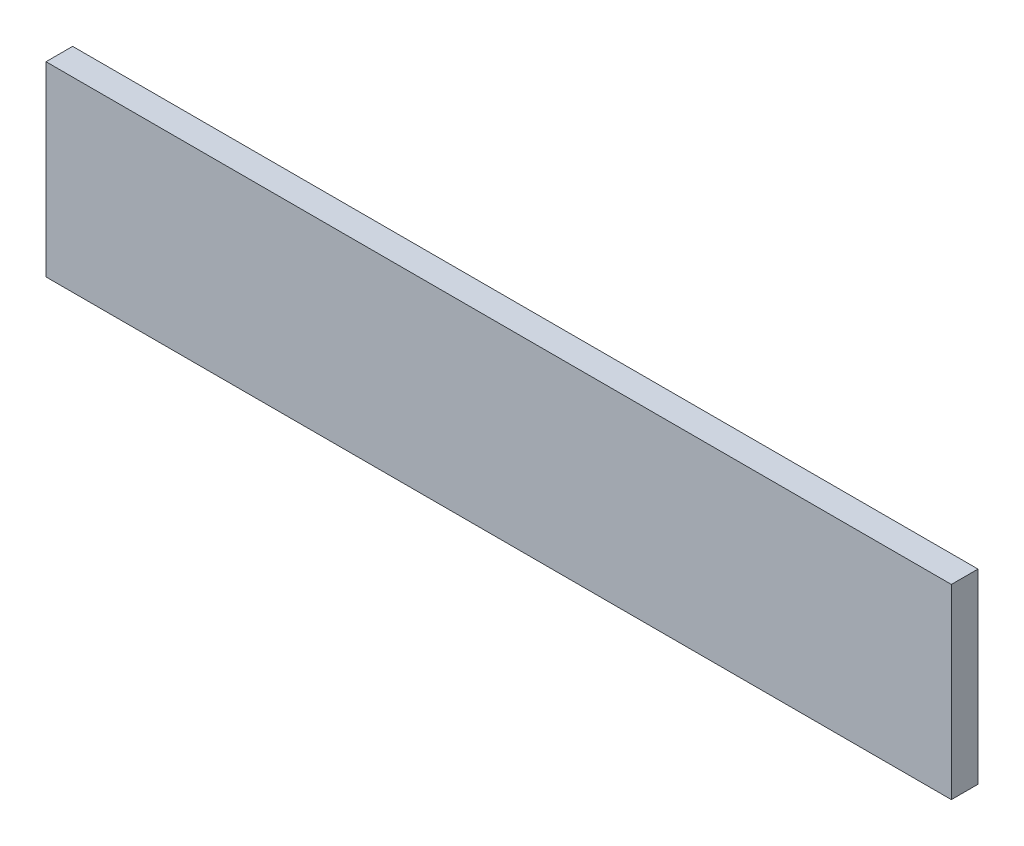
ISO-10303-21;
HEADER;
FILE_DESCRIPTION(('STEP AP214'),'2;1');
FILE_NAME('part.step','',(''),(''),'','','');
FILE_SCHEMA(('AUTOMOTIVE_DESIGN { 1 0 10303 214 1 1 1 1 }'));
ENDSEC;
DATA;
#1=APPLICATION_CONTEXT('core data for automotive mechanical design processes');
#2=APPLICATION_PROTOCOL_DEFINITION('international standard','automotive_design',2000,#1);
#3=PRODUCT_CONTEXT('',#1,'mechanical');
#4=PRODUCT('Part','Part','',(#3));
#5=PRODUCT_RELATED_PRODUCT_CATEGORY('part','',(#4));
#6=PRODUCT_DEFINITION_FORMATION('','',#4);
#7=PRODUCT_DEFINITION_CONTEXT('part definition',#1,'design');
#8=PRODUCT_DEFINITION('design','',#6,#7);
#9=PRODUCT_DEFINITION_SHAPE('','',#8);
#10=(LENGTH_UNIT() NAMED_UNIT(*) SI_UNIT(.MILLI.,.METRE.));
#11=(NAMED_UNIT(*) PLANE_ANGLE_UNIT() SI_UNIT($,.RADIAN.));
#12=(NAMED_UNIT(*) SI_UNIT($,.STERADIAN.) SOLID_ANGLE_UNIT());
#13=UNCERTAINTY_MEASURE_WITH_UNIT(LENGTH_MEASURE(1.E-05),#10,'distance_accuracy_value','');
#14=(GEOMETRIC_REPRESENTATION_CONTEXT(3) GLOBAL_UNCERTAINTY_ASSIGNED_CONTEXT((#13)) GLOBAL_UNIT_ASSIGNED_CONTEXT((#10,
#11,#12)) REPRESENTATION_CONTEXT('',''));
#15=CARTESIAN_POINT('',(0.,0.,0.));
#16=DIRECTION('',(0.,0.,1.));
#17=DIRECTION('',(1.,0.,0.));
#18=AXIS2_PLACEMENT_3D('',#15,#16,#17);
#19=CARTESIAN_POINT('',(-70.,62.9999999999999,10.));
#20=DIRECTION('',(1.,0.,0.));
#21=DIRECTION('',(0.,0.,-1.));
#22=AXIS2_PLACEMENT_3D('',#19,#20,#21);
#23=PLANE('',#22);
#24=DIRECTION('',(0.,-1.,0.));
#25=VECTOR('',#24,1.);
#26=CARTESIAN_POINT('',(-70.,62.9999999999999,0.));
#27=LINE('',#26,#25);
#28=CARTESIAN_POINT('',(-70.,62.9999999999999,0.));
#29=VERTEX_POINT('',#28);
#30=CARTESIAN_POINT('',(-70.,-7.00000000000001,0.));
#31=VERTEX_POINT('',#30);
#32=EDGE_CURVE('E96',#29,#31,#27,.T.);
#33=ORIENTED_EDGE('',*,*,#32,.T.);
#34=DIRECTION('',(0.,0.,-1.));
#35=VECTOR('',#34,1.);
#36=CARTESIAN_POINT('',(-70.,-7.00000000000001,10.));
#37=LINE('',#36,#35);
#38=CARTESIAN_POINT('',(-70.,-7.00000000000001,10.));
#39=VERTEX_POINT('',#38);
#40=EDGE_CURVE('E11',#39,#31,#37,.T.);
#41=ORIENTED_EDGE('',*,*,#40,.F.);
#42=DIRECTION('',(0.,-1.,0.));
#43=VECTOR('',#42,1.);
#44=CARTESIAN_POINT('',(-70.,62.9999999999999,10.));
#45=LINE('',#44,#43);
#46=CARTESIAN_POINT('',(-70.,62.9999999999999,10.));
#47=VERTEX_POINT('',#46);
#48=EDGE_CURVE('E84',#47,#39,#45,.T.);
#49=ORIENTED_EDGE('',*,*,#48,.F.);
#50=DIRECTION('',(0.,0.,-1.));
#51=VECTOR('',#50,1.);
#52=CARTESIAN_POINT('',(-70.,62.9999999999999,10.));
#53=LINE('',#52,#51);
#54=EDGE_CURVE('E92',#47,#29,#53,.T.);
#55=ORIENTED_EDGE('',*,*,#54,.T.);
#56=EDGE_LOOP('',(#33,#41,#49,#55));
#57=FACE_BOUND('',#56,.T.);
#58=ADVANCED_FACE('F33',(#57),#23,.F.);
#59=CARTESIAN_POINT('',(-70.,-7.00000000000001,10.));
#60=DIRECTION('',(0.,1.,0.));
#61=DIRECTION('',(0.,0.,1.));
#62=AXIS2_PLACEMENT_3D('',#59,#60,#61);
#63=PLANE('',#62);
#64=DIRECTION('',(1.,0.,0.));
#65=VECTOR('',#64,1.);
#66=CARTESIAN_POINT('',(-70.,-7.00000000000001,0.));
#67=LINE('',#66,#65);
#68=CARTESIAN_POINT('',(270.,-7.00000000000001,0.));
#69=VERTEX_POINT('',#68);
#70=EDGE_CURVE('E88',#31,#69,#67,.T.);
#71=ORIENTED_EDGE('',*,*,#70,.T.);
#72=DIRECTION('',(0.,0.,-1.));
#73=VECTOR('',#72,1.);
#74=CARTESIAN_POINT('',(270.,-7.00000000000001,10.));
#75=LINE('',#74,#73);
#76=CARTESIAN_POINT('',(270.,-7.00000000000001,10.));
#77=VERTEX_POINT('',#76);
#78=EDGE_CURVE('E41',#77,#69,#75,.T.);
#79=ORIENTED_EDGE('',*,*,#78,.F.);
#80=DIRECTION('',(1.,0.,0.));
#81=VECTOR('',#80,1.);
#82=CARTESIAN_POINT('',(-70.,-7.00000000000001,10.));
#83=LINE('',#82,#81);
#84=EDGE_CURVE('E79',#39,#77,#83,.T.);
#85=ORIENTED_EDGE('',*,*,#84,.F.);
#86=ORIENTED_EDGE('',*,*,#40,.T.);
#87=EDGE_LOOP('',(#71,#79,#85,#86));
#88=FACE_BOUND('',#87,.T.);
#89=ADVANCED_FACE('F87',(#88),#63,.F.);
#90=CARTESIAN_POINT('',(270.,63.,10.));
#91=DIRECTION('',(-1.,0.,0.));
#92=DIRECTION('',(0.,-1.,0.));
#93=AXIS2_PLACEMENT_3D('',#90,#91,#92);
#94=PLANE('',#93);
#95=DIRECTION('',(0.,1.,0.));
#96=VECTOR('',#95,1.);
#97=CARTESIAN_POINT('',(270.,63.,0.));
#98=LINE('',#97,#96);
#99=CARTESIAN_POINT('',(270.,63.,0.));
#100=VERTEX_POINT('',#99);
#101=EDGE_CURVE('E66',#69,#100,#98,.T.);
#102=ORIENTED_EDGE('',*,*,#101,.T.);
#103=DIRECTION('',(0.,0.,-1.));
#104=VECTOR('',#103,1.);
#105=CARTESIAN_POINT('',(270.,63.,10.));
#106=LINE('',#105,#104);
#107=CARTESIAN_POINT('',(270.,63.,10.));
#108=VERTEX_POINT('',#107);
#109=EDGE_CURVE('E89',#108,#100,#106,.T.);
#110=ORIENTED_EDGE('',*,*,#109,.F.);
#111=DIRECTION('',(0.,1.,0.));
#112=VECTOR('',#111,1.);
#113=CARTESIAN_POINT('',(270.,63.,10.));
#114=LINE('',#113,#112);
#115=EDGE_CURVE('E82',#77,#108,#114,.T.);
#116=ORIENTED_EDGE('',*,*,#115,.F.);
#117=ORIENTED_EDGE('',*,*,#78,.T.);
#118=EDGE_LOOP('',(#102,#110,#116,#117));
#119=FACE_BOUND('',#118,.T.);
#120=ADVANCED_FACE('F90',(#119),#94,.F.);
#121=CARTESIAN_POINT('',(-70.,62.9999999999999,10.));
#122=DIRECTION('',(0.,-1.,0.));
#123=DIRECTION('',(1.,0.,0.));
#124=AXIS2_PLACEMENT_3D('',#121,#122,#123);
#125=PLANE('',#124);
#126=DIRECTION('',(-1.,0.,0.));
#127=VECTOR('',#126,1.);
#128=CARTESIAN_POINT('',(-70.,62.9999999999999,0.));
#129=LINE('',#128,#127);
#130=EDGE_CURVE('E72',#100,#29,#129,.T.);
#131=ORIENTED_EDGE('',*,*,#130,.T.);
#132=ORIENTED_EDGE('',*,*,#54,.F.);
#133=DIRECTION('',(-1.,0.,0.));
#134=VECTOR('',#133,1.);
#135=CARTESIAN_POINT('',(-70.,62.9999999999999,10.));
#136=LINE('',#135,#134);
#137=EDGE_CURVE('E49',#108,#47,#136,.T.);
#138=ORIENTED_EDGE('',*,*,#137,.F.);
#139=ORIENTED_EDGE('',*,*,#109,.T.);
#140=EDGE_LOOP('',(#131,#132,#138,#139));
#141=FACE_BOUND('',#140,.T.);
#142=ADVANCED_FACE('F103',(#141),#125,.F.);
#143=CARTESIAN_POINT('',(0.,0.,10.));
#144=DIRECTION('',(0.,0.,1.));
#145=DIRECTION('',(1.,0.,0.));
#146=AXIS2_PLACEMENT_3D('',#143,#144,#145);
#147=PLANE('',#146);
#148=ORIENTED_EDGE('',*,*,#48,.T.);
#149=ORIENTED_EDGE('',*,*,#84,.T.);
#150=ORIENTED_EDGE('',*,*,#115,.T.);
#151=ORIENTED_EDGE('',*,*,#137,.T.);
#152=EDGE_LOOP('',(#148,#149,#150,#151));
#153=FACE_BOUND('',#152,.T.);
#154=ADVANCED_FACE('F80',(#153),#147,.T.);
#155=CARTESIAN_POINT('',(0.,0.,0.));
#156=DIRECTION('',(0.,0.,1.));
#157=DIRECTION('',(1.,0.,0.));
#158=AXIS2_PLACEMENT_3D('',#155,#156,#157);
#159=PLANE('',#158);
#160=ORIENTED_EDGE('',*,*,#32,.F.);
#161=ORIENTED_EDGE('',*,*,#130,.F.);
#162=ORIENTED_EDGE('',*,*,#101,.F.);
#163=ORIENTED_EDGE('',*,*,#70,.F.);
#164=EDGE_LOOP('',(#160,#161,#162,#163));
#165=FACE_BOUND('',#164,.T.);
#166=ADVANCED_FACE('F106',(#165),#159,.F.);
#167=CLOSED_SHELL('',(#58,#89,#120,#142,#154,#166));
#168=MANIFOLD_SOLID_BREP('B2',#167);
#169=ADVANCED_BREP_SHAPE_REPRESENTATION('',(#18,#168),#14);
#170=SHAPE_DEFINITION_REPRESENTATION(#9,#169);
ENDSEC;
END-ISO-10303-21;
